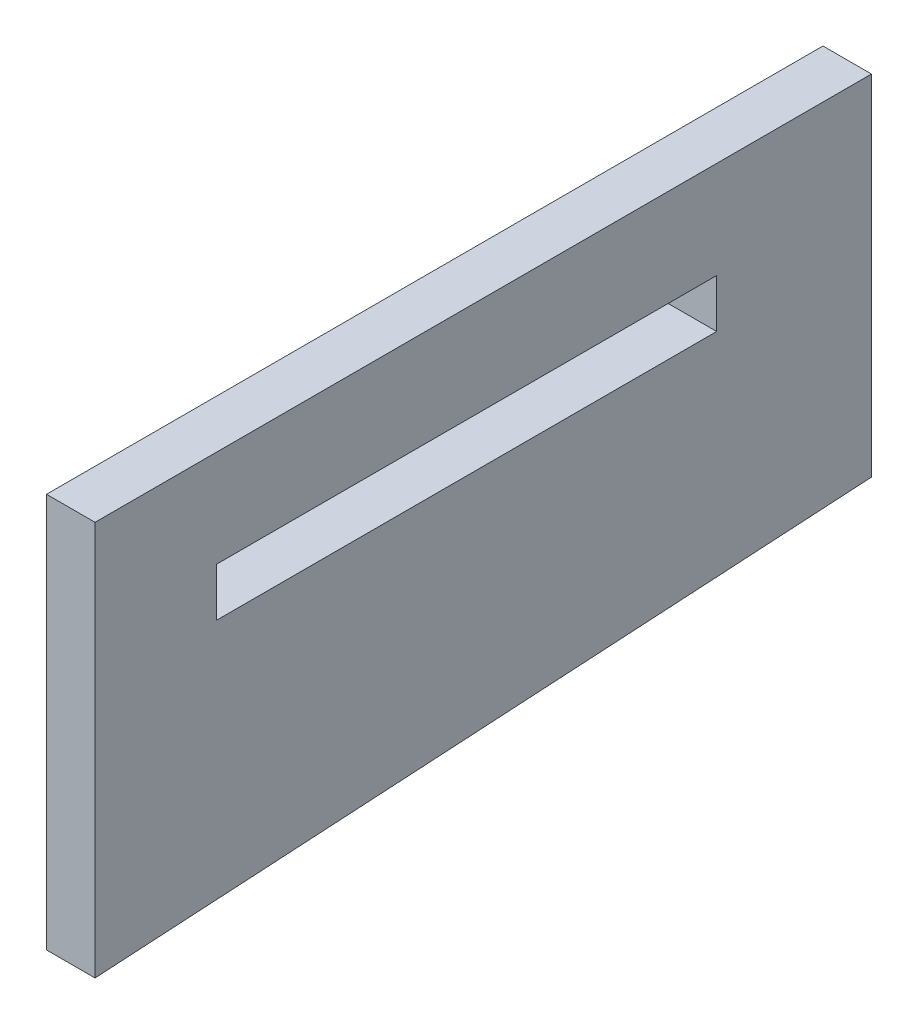
ISO-10303-21;
HEADER;
FILE_DESCRIPTION(('STEP AP214'),'2;1');
FILE_NAME('part.step','',(''),(''),'','','');
FILE_SCHEMA(('AUTOMOTIVE_DESIGN { 1 0 10303 214 1 1 1 1 }'));
ENDSEC;
DATA;
#1=APPLICATION_CONTEXT('core data for automotive mechanical design processes');
#2=APPLICATION_PROTOCOL_DEFINITION('international standard','automotive_design',2000,#1);
#3=PRODUCT_CONTEXT('',#1,'mechanical');
#4=PRODUCT('Part','Part','',(#3));
#5=PRODUCT_RELATED_PRODUCT_CATEGORY('part','',(#4));
#6=PRODUCT_DEFINITION_FORMATION('','',#4);
#7=PRODUCT_DEFINITION_CONTEXT('part definition',#1,'design');
#8=PRODUCT_DEFINITION('design','',#6,#7);
#9=PRODUCT_DEFINITION_SHAPE('','',#8);
#10=(LENGTH_UNIT() NAMED_UNIT(*) SI_UNIT(.MILLI.,.METRE.));
#11=(NAMED_UNIT(*) PLANE_ANGLE_UNIT() SI_UNIT($,.RADIAN.));
#12=(NAMED_UNIT(*) SI_UNIT($,.STERADIAN.) SOLID_ANGLE_UNIT());
#13=UNCERTAINTY_MEASURE_WITH_UNIT(LENGTH_MEASURE(1.E-05),#10,'distance_accuracy_value','');
#14=(GEOMETRIC_REPRESENTATION_CONTEXT(3) GLOBAL_UNCERTAINTY_ASSIGNED_CONTEXT((#13)) GLOBAL_UNIT_ASSIGNED_CONTEXT((#10,
#11,#12)) REPRESENTATION_CONTEXT('',''));
#15=CARTESIAN_POINT('',(0.,0.,0.));
#16=DIRECTION('',(0.,0.,1.));
#17=DIRECTION('',(1.,0.,0.));
#18=AXIS2_PLACEMENT_3D('',#15,#16,#17);
#19=CARTESIAN_POINT('',(-3.175,-16.2960419682553,40.6726531693293));
#20=DIRECTION('',(0.,0.,1.));
#21=DIRECTION('',(0.,-1.,0.));
#22=AXIS2_PLACEMENT_3D('',#19,#20,#21);
#23=PLANE('',#22);
#24=DIRECTION('',(0.,-1.,0.));
#25=VECTOR('',#24,1.);
#26=CARTESIAN_POINT('',(0.,-16.2960419682553,40.6726531693293));
#27=LINE('',#26,#25);
#28=CARTESIAN_POINT('',(0.,9.525,40.6726531693294));
#29=VERTEX_POINT('',#28);
#30=CARTESIAN_POINT('',(0.,-16.2960419682553,40.6726531693293));
#31=VERTEX_POINT('',#30);
#32=EDGE_CURVE('E139',#29,#31,#27,.T.);
#33=ORIENTED_EDGE('',*,*,#32,.F.);
#34=DIRECTION('',(1.,0.,0.));
#35=VECTOR('',#34,1.);
#36=CARTESIAN_POINT('',(-3.175,9.525,40.6726531693294));
#37=LINE('',#36,#35);
#38=CARTESIAN_POINT('',(-3.175,9.525,40.6726531693294));
#39=VERTEX_POINT('',#38);
#40=EDGE_CURVE('E11',#39,#29,#37,.T.);
#41=ORIENTED_EDGE('',*,*,#40,.F.);
#42=DIRECTION('',(0.,-1.,0.));
#43=VECTOR('',#42,1.);
#44=CARTESIAN_POINT('',(-3.175,-16.2960419682553,40.6726531693293));
#45=LINE('',#44,#43);
#46=CARTESIAN_POINT('',(-3.175,-16.2960419682553,40.6726531693293));
#47=VERTEX_POINT('',#46);
#48=EDGE_CURVE('E143',#39,#47,#45,.T.);
#49=ORIENTED_EDGE('',*,*,#48,.T.);
#50=DIRECTION('',(1.,0.,0.));
#51=VECTOR('',#50,1.);
#52=CARTESIAN_POINT('',(-3.175,-16.2960419682553,40.6726531693293));
#53=LINE('',#52,#51);
#54=EDGE_CURVE('E43',#47,#31,#53,.T.);
#55=ORIENTED_EDGE('',*,*,#54,.T.);
#56=EDGE_LOOP('',(#33,#41,#49,#55));
#57=FACE_BOUND('',#56,.T.);
#58=ADVANCED_FACE('F40',(#57),#23,.T.);
#59=CARTESIAN_POINT('',(-3.175,9.525,40.6726531693294));
#60=DIRECTION('',(0.,1.,0.));
#61=DIRECTION('',(0.,0.,1.));
#62=AXIS2_PLACEMENT_3D('',#59,#60,#61);
#63=PLANE('',#62);
#64=DIRECTION('',(0.,0.,1.));
#65=VECTOR('',#64,1.);
#66=CARTESIAN_POINT('',(0.,9.525,40.6726531693294));
#67=LINE('',#66,#65);
#68=CARTESIAN_POINT('',(0.,9.52500000000001,-10.1273468306707));
#69=VERTEX_POINT('',#68);
#70=EDGE_CURVE('E147',#69,#29,#67,.T.);
#71=ORIENTED_EDGE('',*,*,#70,.F.);
#72=DIRECTION('',(1.,0.,0.));
#73=VECTOR('',#72,1.);
#74=CARTESIAN_POINT('',(-3.175,9.52500000000001,-10.1273468306707));
#75=LINE('',#74,#73);
#76=CARTESIAN_POINT('',(-3.175,9.52500000000001,-10.1273468306707));
#77=VERTEX_POINT('',#76);
#78=EDGE_CURVE('E48',#77,#69,#75,.T.);
#79=ORIENTED_EDGE('',*,*,#78,.F.);
#80=DIRECTION('',(0.,0.,1.));
#81=VECTOR('',#80,1.);
#82=CARTESIAN_POINT('',(-3.175,9.525,40.6726531693294));
#83=LINE('',#82,#81);
#84=EDGE_CURVE('E153',#77,#39,#83,.T.);
#85=ORIENTED_EDGE('',*,*,#84,.T.);
#86=ORIENTED_EDGE('',*,*,#40,.T.);
#87=EDGE_LOOP('',(#71,#79,#85,#86));
#88=FACE_BOUND('',#87,.T.);
#89=ADVANCED_FACE('F179',(#88),#63,.T.);
#90=CARTESIAN_POINT('',(-3.175,9.52500000000001,-10.1273468306707));
#91=DIRECTION('',(0.,0.,-1.));
#92=DIRECTION('',(0.,1.,0.));
#93=AXIS2_PLACEMENT_3D('',#90,#91,#92);
#94=PLANE('',#93);
#95=DIRECTION('',(0.,1.,0.));
#96=VECTOR('',#95,1.);
#97=CARTESIAN_POINT('',(0.,9.52500000000001,-10.1273468306707));
#98=LINE('',#97,#96);
#99=CARTESIAN_POINT('',(0.,-13.3166806211609,-10.1273468306707));
#100=VERTEX_POINT('',#99);
#101=EDGE_CURVE('E161',#100,#69,#98,.T.);
#102=ORIENTED_EDGE('',*,*,#101,.F.);
#103=DIRECTION('',(1.,0.,0.));
#104=VECTOR('',#103,1.);
#105=CARTESIAN_POINT('',(-3.175,-13.3166806211609,-10.1273468306707));
#106=LINE('',#105,#104);
#107=CARTESIAN_POINT('',(-3.175,-13.3166806211609,-10.1273468306707));
#108=VERTEX_POINT('',#107);
#109=EDGE_CURVE('E166',#108,#100,#106,.T.);
#110=ORIENTED_EDGE('',*,*,#109,.F.);
#111=DIRECTION('',(0.,1.,0.));
#112=VECTOR('',#111,1.);
#113=CARTESIAN_POINT('',(-3.175,9.52500000000001,-10.1273468306707));
#114=LINE('',#113,#112);
#115=EDGE_CURVE('E150',#108,#77,#114,.T.);
#116=ORIENTED_EDGE('',*,*,#115,.T.);
#117=ORIENTED_EDGE('',*,*,#78,.T.);
#118=EDGE_LOOP('',(#102,#110,#116,#117));
#119=FACE_BOUND('',#118,.T.);
#120=ADVANCED_FACE('F183',(#119),#94,.T.);
#121=CARTESIAN_POINT('',(-3.175,-13.3166806211609,-10.1273468306707));
#122=DIRECTION('',(0.,-0.998284580578913,-0.0585482380467946));
#123=DIRECTION('',(0.,0.0585482380467946,-0.998284580578913));
#124=AXIS2_PLACEMENT_3D('',#121,#122,#123);
#125=PLANE('',#124);
#126=DIRECTION('',(0.,0.0585482380467946,-0.998284580578913));
#127=VECTOR('',#126,1.);
#128=CARTESIAN_POINT('',(0.,-13.3166806211609,-10.1273468306707));
#129=LINE('',#128,#127);
#130=EDGE_CURVE('E158',#31,#100,#129,.T.);
#131=ORIENTED_EDGE('',*,*,#130,.F.);
#132=ORIENTED_EDGE('',*,*,#54,.F.);
#133=DIRECTION('',(0.,0.0585482380467946,-0.998284580578913));
#134=VECTOR('',#133,1.);
#135=CARTESIAN_POINT('',(-3.175,-13.3166806211609,-10.1273468306707));
#136=LINE('',#135,#134);
#137=EDGE_CURVE('E146',#47,#108,#136,.T.);
#138=ORIENTED_EDGE('',*,*,#137,.T.);
#139=ORIENTED_EDGE('',*,*,#109,.T.);
#140=EDGE_LOOP('',(#131,#132,#138,#139));
#141=FACE_BOUND('',#140,.T.);
#142=ADVANCED_FACE('F174',(#141),#125,.T.);
#143=CARTESIAN_POINT('',(-3.175,0.,0.));
#144=DIRECTION('',(-1.,0.,0.));
#145=DIRECTION('',(0.,0.,1.));
#146=AXIS2_PLACEMENT_3D('',#143,#144,#145);
#147=PLANE('',#146);
#148=DIRECTION('',(0.,-1.,0.));
#149=VECTOR('',#148,1.);
#150=CARTESIAN_POINT('',(-3.175,3.175,32.7351531693347));
#151=LINE('',#150,#149);
#152=CARTESIAN_POINT('',(-3.175,3.175,32.7351531693347));
#153=VERTEX_POINT('',#152);
#154=CARTESIAN_POINT('',(-3.175,0.,32.7351531693348));
#155=VERTEX_POINT('',#154);
#156=EDGE_CURVE('E107',#153,#155,#151,.T.);
#157=ORIENTED_EDGE('',*,*,#156,.T.);
#158=DIRECTION('',(0.,0.,-1.));
#159=VECTOR('',#158,1.);
#160=CARTESIAN_POINT('',(-3.175,0.,32.7351531693348));
#161=LINE('',#160,#159);
#162=CARTESIAN_POINT('',(-3.175,0.,0.));
#163=VERTEX_POINT('',#162);
#164=EDGE_CURVE('E116',#155,#163,#161,.T.);
#165=ORIENTED_EDGE('',*,*,#164,.T.);
#166=DIRECTION('',(0.,1.,0.));
#167=VECTOR('',#166,1.);
#168=CARTESIAN_POINT('',(-3.175,3.175,0.));
#169=LINE('',#168,#167);
#170=CARTESIAN_POINT('',(-3.175,3.175,0.));
#171=VERTEX_POINT('',#170);
#172=EDGE_CURVE('E56',#163,#171,#169,.T.);
#173=ORIENTED_EDGE('',*,*,#172,.T.);
#174=DIRECTION('',(0.,0.,1.));
#175=VECTOR('',#174,1.);
#176=CARTESIAN_POINT('',(-3.175,3.175,32.7351531693347));
#177=LINE('',#176,#175);
#178=EDGE_CURVE('E113',#171,#153,#177,.T.);
#179=ORIENTED_EDGE('',*,*,#178,.T.);
#180=EDGE_LOOP('',(#157,#165,#173,#179));
#181=FACE_BOUND('',#180,.T.);
#182=ORIENTED_EDGE('',*,*,#48,.F.);
#183=ORIENTED_EDGE('',*,*,#84,.F.);
#184=ORIENTED_EDGE('',*,*,#115,.F.);
#185=ORIENTED_EDGE('',*,*,#137,.F.);
#186=EDGE_LOOP('',(#182,#183,#184,#185));
#187=FACE_BOUND('',#186,.T.);
#188=ADVANCED_FACE('F120',(#181,#187),#147,.T.);
#189=CARTESIAN_POINT('',(0.,0.,0.));
#190=DIRECTION('',(-1.,0.,0.));
#191=DIRECTION('',(0.,0.,1.));
#192=AXIS2_PLACEMENT_3D('',#189,#190,#191);
#193=PLANE('',#192);
#194=DIRECTION('',(0.,0.,-1.));
#195=VECTOR('',#194,1.);
#196=CARTESIAN_POINT('',(0.,0.,32.7351531693348));
#197=LINE('',#196,#195);
#198=CARTESIAN_POINT('',(0.,0.,32.7351531693348));
#199=VERTEX_POINT('',#198);
#200=CARTESIAN_POINT('',(0.,0.,0.));
#201=VERTEX_POINT('',#200);
#202=EDGE_CURVE('E133',#199,#201,#197,.T.);
#203=ORIENTED_EDGE('',*,*,#202,.F.);
#204=DIRECTION('',(0.,-1.,0.));
#205=VECTOR('',#204,1.);
#206=CARTESIAN_POINT('',(0.,3.175,32.7351531693347));
#207=LINE('',#206,#205);
#208=CARTESIAN_POINT('',(0.,3.175,32.7351531693347));
#209=VERTEX_POINT('',#208);
#210=EDGE_CURVE('E64',#209,#199,#207,.T.);
#211=ORIENTED_EDGE('',*,*,#210,.F.);
#212=DIRECTION('',(0.,0.,1.));
#213=VECTOR('',#212,1.);
#214=CARTESIAN_POINT('',(0.,3.175,32.7351531693347));
#215=LINE('',#214,#213);
#216=CARTESIAN_POINT('',(0.,3.175,0.));
#217=VERTEX_POINT('',#216);
#218=EDGE_CURVE('E123',#217,#209,#215,.T.);
#219=ORIENTED_EDGE('',*,*,#218,.F.);
#220=DIRECTION('',(0.,1.,0.));
#221=VECTOR('',#220,1.);
#222=CARTESIAN_POINT('',(0.,3.175,0.));
#223=LINE('',#222,#221);
#224=EDGE_CURVE('E126',#201,#217,#223,.T.);
#225=ORIENTED_EDGE('',*,*,#224,.F.);
#226=EDGE_LOOP('',(#203,#211,#219,#225));
#227=FACE_BOUND('',#226,.T.);
#228=ORIENTED_EDGE('',*,*,#32,.T.);
#229=ORIENTED_EDGE('',*,*,#130,.T.);
#230=ORIENTED_EDGE('',*,*,#101,.T.);
#231=ORIENTED_EDGE('',*,*,#70,.T.);
#232=EDGE_LOOP('',(#228,#229,#230,#231));
#233=FACE_BOUND('',#232,.T.);
#234=ADVANCED_FACE('F176',(#227,#233),#193,.F.);
#235=CARTESIAN_POINT('',(-3.175,3.175,32.7351531693347));
#236=DIRECTION('',(0.,0.,1.));
#237=DIRECTION('',(0.,-1.,0.));
#238=AXIS2_PLACEMENT_3D('',#235,#236,#237);
#239=PLANE('',#238);
#240=ORIENTED_EDGE('',*,*,#210,.T.);
#241=DIRECTION('',(1.,0.,0.));
#242=VECTOR('',#241,1.);
#243=CARTESIAN_POINT('',(-3.175,0.,32.7351531693348));
#244=LINE('',#243,#242);
#245=EDGE_CURVE('E103',#155,#199,#244,.T.);
#246=ORIENTED_EDGE('',*,*,#245,.F.);
#247=ORIENTED_EDGE('',*,*,#156,.F.);
#248=DIRECTION('',(1.,0.,0.));
#249=VECTOR('',#248,1.);
#250=CARTESIAN_POINT('',(-3.175,3.175,32.7351531693347));
#251=LINE('',#250,#249);
#252=EDGE_CURVE('E137',#153,#209,#251,.T.);
#253=ORIENTED_EDGE('',*,*,#252,.T.);
#254=EDGE_LOOP('',(#240,#246,#247,#253));
#255=FACE_BOUND('',#254,.T.);
#256=ADVANCED_FACE('F105',(#255),#239,.F.);
#257=CARTESIAN_POINT('',(-3.175,3.175,32.7351531693347));
#258=DIRECTION('',(0.,1.,0.));
#259=DIRECTION('',(0.,0.,1.));
#260=AXIS2_PLACEMENT_3D('',#257,#258,#259);
#261=PLANE('',#260);
#262=ORIENTED_EDGE('',*,*,#218,.T.);
#263=ORIENTED_EDGE('',*,*,#252,.F.);
#264=ORIENTED_EDGE('',*,*,#178,.F.);
#265=DIRECTION('',(1.,0.,0.));
#266=VECTOR('',#265,1.);
#267=CARTESIAN_POINT('',(-3.175,3.175,0.));
#268=LINE('',#267,#266);
#269=EDGE_CURVE('E140',#171,#217,#268,.T.);
#270=ORIENTED_EDGE('',*,*,#269,.T.);
#271=EDGE_LOOP('',(#262,#263,#264,#270));
#272=FACE_BOUND('',#271,.T.);
#273=ADVANCED_FACE('F235',(#272),#261,.F.);
#274=CARTESIAN_POINT('',(-3.175,3.175,0.));
#275=DIRECTION('',(0.,0.,-1.));
#276=DIRECTION('',(-1.,0.,0.));
#277=AXIS2_PLACEMENT_3D('',#274,#275,#276);
#278=PLANE('',#277);
#279=ORIENTED_EDGE('',*,*,#224,.T.);
#280=ORIENTED_EDGE('',*,*,#269,.F.);
#281=ORIENTED_EDGE('',*,*,#172,.F.);
#282=DIRECTION('',(1.,0.,0.));
#283=VECTOR('',#282,1.);
#284=CARTESIAN_POINT('',(-3.175,0.,0.));
#285=LINE('',#284,#283);
#286=EDGE_CURVE('E112',#163,#201,#285,.T.);
#287=ORIENTED_EDGE('',*,*,#286,.T.);
#288=EDGE_LOOP('',(#279,#280,#281,#287));
#289=FACE_BOUND('',#288,.T.);
#290=ADVANCED_FACE('F244',(#289),#278,.F.);
#291=CARTESIAN_POINT('',(-3.175,0.,32.7351531693348));
#292=DIRECTION('',(0.,-1.,0.));
#293=DIRECTION('',(0.,0.,-1.));
#294=AXIS2_PLACEMENT_3D('',#291,#292,#293);
#295=PLANE('',#294);
#296=ORIENTED_EDGE('',*,*,#202,.T.);
#297=ORIENTED_EDGE('',*,*,#286,.F.);
#298=ORIENTED_EDGE('',*,*,#164,.F.);
#299=ORIENTED_EDGE('',*,*,#245,.T.);
#300=EDGE_LOOP('',(#296,#297,#298,#299));
#301=FACE_BOUND('',#300,.T.);
#302=ADVANCED_FACE('F117',(#301),#295,.F.);
#303=CLOSED_SHELL('',(#58,#89,#120,#142,#188,#234,#256,#273,#290,#302));
#304=MANIFOLD_SOLID_BREP('B2',#303);
#305=ADVANCED_BREP_SHAPE_REPRESENTATION('',(#18,#304),#14);
#306=SHAPE_DEFINITION_REPRESENTATION(#9,#305);
ENDSEC;
END-ISO-10303-21;
